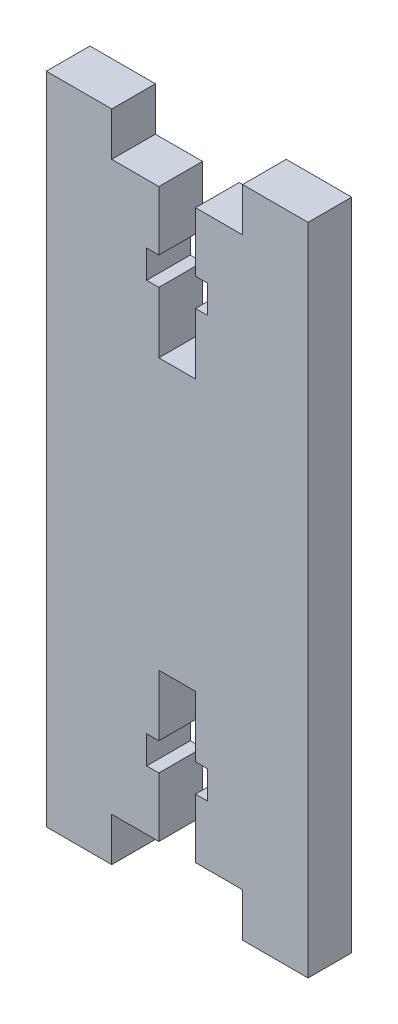
ISO-10303-21;
HEADER;
FILE_DESCRIPTION(('STEP AP214'),'2;1');
FILE_NAME('part.step','',(''),(''),'','','');
FILE_SCHEMA(('AUTOMOTIVE_DESIGN { 1 0 10303 214 1 1 1 1 }'));
ENDSEC;
DATA;
#1=APPLICATION_CONTEXT('core data for automotive mechanical design processes');
#2=APPLICATION_PROTOCOL_DEFINITION('international standard','automotive_design',2000,#1);
#3=PRODUCT_CONTEXT('',#1,'mechanical');
#4=PRODUCT('Part','Part','',(#3));
#5=PRODUCT_RELATED_PRODUCT_CATEGORY('part','',(#4));
#6=PRODUCT_DEFINITION_FORMATION('','',#4);
#7=PRODUCT_DEFINITION_CONTEXT('part definition',#1,'design');
#8=PRODUCT_DEFINITION('design','',#6,#7);
#9=PRODUCT_DEFINITION_SHAPE('','',#8);
#10=(LENGTH_UNIT() NAMED_UNIT(*) SI_UNIT(.MILLI.,.METRE.));
#11=(NAMED_UNIT(*) PLANE_ANGLE_UNIT() SI_UNIT($,.RADIAN.));
#12=(NAMED_UNIT(*) SI_UNIT($,.STERADIAN.) SOLID_ANGLE_UNIT());
#13=UNCERTAINTY_MEASURE_WITH_UNIT(LENGTH_MEASURE(1.E-05),#10,'distance_accuracy_value','');
#14=(GEOMETRIC_REPRESENTATION_CONTEXT(3) GLOBAL_UNCERTAINTY_ASSIGNED_CONTEXT((#13)) GLOBAL_UNIT_ASSIGNED_CONTEXT((#10,
#11,#12)) REPRESENTATION_CONTEXT('',''));
#15=CARTESIAN_POINT('',(0.,0.,0.));
#16=DIRECTION('',(0.,0.,1.));
#17=DIRECTION('',(1.,0.,0.));
#18=AXIS2_PLACEMENT_3D('',#15,#16,#17);
#19=CARTESIAN_POINT('',(0.,0.,5.));
#20=DIRECTION('',(0.,-1.,0.));
#21=DIRECTION('',(1.,0.,0.));
#22=AXIS2_PLACEMENT_3D('',#19,#20,#21);
#23=PLANE('',#22);
#24=DIRECTION('',(-1.,0.,0.));
#25=VECTOR('',#24,1.);
#26=CARTESIAN_POINT('',(0.,0.,0.));
#27=LINE('',#26,#25);
#28=CARTESIAN_POINT('',(-17.1,0.,0.));
#29=VERTEX_POINT('',#28);
#30=CARTESIAN_POINT('',(-22.5,0.,0.));
#31=VERTEX_POINT('',#30);
#32=EDGE_CURVE('E301',#29,#31,#27,.T.);
#33=ORIENTED_EDGE('',*,*,#32,.F.);
#34=DIRECTION('',(0.,0.,-1.));
#35=VECTOR('',#34,1.);
#36=CARTESIAN_POINT('',(-17.1,0.,5.));
#37=LINE('',#36,#35);
#38=CARTESIAN_POINT('',(-17.1,0.,5.));
#39=VERTEX_POINT('',#38);
#40=EDGE_CURVE('E11',#39,#29,#37,.T.);
#41=ORIENTED_EDGE('',*,*,#40,.F.);
#42=DIRECTION('',(-1.,0.,0.));
#43=VECTOR('',#42,1.);
#44=CARTESIAN_POINT('',(0.,0.,5.));
#45=LINE('',#44,#43);
#46=CARTESIAN_POINT('',(-22.5,0.,5.));
#47=VERTEX_POINT('',#46);
#48=EDGE_CURVE('E394',#39,#47,#45,.T.);
#49=ORIENTED_EDGE('',*,*,#48,.T.);
#50=DIRECTION('',(0.,0.,-1.));
#51=VECTOR('',#50,1.);
#52=CARTESIAN_POINT('',(-22.5,0.,5.));
#53=LINE('',#52,#51);
#54=EDGE_CURVE('E54',#47,#31,#53,.T.);
#55=ORIENTED_EDGE('',*,*,#54,.T.);
#56=EDGE_LOOP('',(#33,#41,#49,#55));
#57=FACE_BOUND('',#56,.T.);
#58=ADVANCED_FACE('F37',(#57),#23,.T.);
#59=CARTESIAN_POINT('',(-17.1,0.,5.));
#60=DIRECTION('',(-1.,0.,0.));
#61=DIRECTION('',(0.,-1.,0.));
#62=AXIS2_PLACEMENT_3D('',#59,#60,#61);
#63=PLANE('',#62);
#64=DIRECTION('',(0.,1.,0.));
#65=VECTOR('',#64,1.);
#66=CARTESIAN_POINT('',(-17.1,0.,0.));
#67=LINE('',#66,#65);
#68=CARTESIAN_POINT('',(-17.1,6.79999999999999,0.));
#69=VERTEX_POINT('',#68);
#70=EDGE_CURVE('E303',#29,#69,#67,.T.);
#71=ORIENTED_EDGE('',*,*,#70,.T.);
#72=DIRECTION('',(0.,0.,-1.));
#73=VECTOR('',#72,1.);
#74=CARTESIAN_POINT('',(-17.1,6.79999999999999,5.));
#75=LINE('',#74,#73);
#76=CARTESIAN_POINT('',(-17.1,6.79999999999999,5.));
#77=VERTEX_POINT('',#76);
#78=EDGE_CURVE('E46',#77,#69,#75,.T.);
#79=ORIENTED_EDGE('',*,*,#78,.F.);
#80=DIRECTION('',(0.,1.,0.));
#81=VECTOR('',#80,1.);
#82=CARTESIAN_POINT('',(-17.1,0.,5.));
#83=LINE('',#82,#81);
#84=EDGE_CURVE('E486',#39,#77,#83,.T.);
#85=ORIENTED_EDGE('',*,*,#84,.F.);
#86=ORIENTED_EDGE('',*,*,#40,.T.);
#87=EDGE_LOOP('',(#71,#79,#85,#86));
#88=FACE_BOUND('',#87,.T.);
#89=ADVANCED_FACE('F39',(#88),#63,.F.);
#90=CARTESIAN_POINT('',(0.,6.79999999999999,5.));
#91=DIRECTION('',(0.,1.,0.));
#92=DIRECTION('',(0.,0.,1.));
#93=AXIS2_PLACEMENT_3D('',#90,#91,#92);
#94=PLANE('',#93);
#95=DIRECTION('',(1.,0.,0.));
#96=VECTOR('',#95,1.);
#97=CARTESIAN_POINT('',(0.,6.79999999999999,0.));
#98=LINE('',#97,#96);
#99=CARTESIAN_POINT('',(-18.5,6.79999999999999,0.));
#100=VERTEX_POINT('',#99);
#101=EDGE_CURVE('E307',#100,#69,#98,.T.);
#102=ORIENTED_EDGE('',*,*,#101,.F.);
#103=DIRECTION('',(0.,0.,-1.));
#104=VECTOR('',#103,1.);
#105=CARTESIAN_POINT('',(-18.5,6.79999999999999,5.));
#106=LINE('',#105,#104);
#107=CARTESIAN_POINT('',(-18.5,6.79999999999999,5.));
#108=VERTEX_POINT('',#107);
#109=EDGE_CURVE('E464',#108,#100,#106,.T.);
#110=ORIENTED_EDGE('',*,*,#109,.F.);
#111=DIRECTION('',(1.,0.,0.));
#112=VECTOR('',#111,1.);
#113=CARTESIAN_POINT('',(0.,6.79999999999999,5.));
#114=LINE('',#113,#112);
#115=EDGE_CURVE('E471',#108,#77,#114,.T.);
#116=ORIENTED_EDGE('',*,*,#115,.T.);
#117=ORIENTED_EDGE('',*,*,#78,.T.);
#118=EDGE_LOOP('',(#102,#110,#116,#117));
#119=FACE_BOUND('',#118,.T.);
#120=ADVANCED_FACE('F469',(#119),#94,.T.);
#121=CARTESIAN_POINT('',(-18.5,0.,5.));
#122=DIRECTION('',(1.,0.,0.));
#123=DIRECTION('',(0.,0.,-1.));
#124=AXIS2_PLACEMENT_3D('',#121,#122,#123);
#125=PLANE('',#124);
#126=DIRECTION('',(0.,-1.,0.));
#127=VECTOR('',#126,1.);
#128=CARTESIAN_POINT('',(-18.5,0.,0.));
#129=LINE('',#128,#127);
#130=CARTESIAN_POINT('',(-18.5,9.99999999999999,0.));
#131=VERTEX_POINT('',#130);
#132=EDGE_CURVE('E310',#131,#100,#129,.T.);
#133=ORIENTED_EDGE('',*,*,#132,.F.);
#134=DIRECTION('',(0.,0.,-1.));
#135=VECTOR('',#134,1.);
#136=CARTESIAN_POINT('',(-18.5,9.99999999999999,5.));
#137=LINE('',#136,#135);
#138=CARTESIAN_POINT('',(-18.5,9.99999999999999,5.));
#139=VERTEX_POINT('',#138);
#140=EDGE_CURVE('E462',#139,#131,#137,.T.);
#141=ORIENTED_EDGE('',*,*,#140,.F.);
#142=DIRECTION('',(0.,-1.,0.));
#143=VECTOR('',#142,1.);
#144=CARTESIAN_POINT('',(-18.5,0.,5.));
#145=LINE('',#144,#143);
#146=EDGE_CURVE('E483',#139,#108,#145,.T.);
#147=ORIENTED_EDGE('',*,*,#146,.T.);
#148=ORIENTED_EDGE('',*,*,#109,.T.);
#149=EDGE_LOOP('',(#133,#141,#147,#148));
#150=FACE_BOUND('',#149,.T.);
#151=ADVANCED_FACE('F480',(#150),#125,.T.);
#152=CARTESIAN_POINT('',(0.,9.9999999999999,5.));
#153=DIRECTION('',(0.,-1.,0.));
#154=DIRECTION('',(1.,0.,0.));
#155=AXIS2_PLACEMENT_3D('',#152,#153,#154);
#156=PLANE('',#155);
#157=DIRECTION('',(-1.,0.,0.));
#158=VECTOR('',#157,1.);
#159=CARTESIAN_POINT('',(0.,9.9999999999999,0.));
#160=LINE('',#159,#158);
#161=CARTESIAN_POINT('',(-17.1,9.99999999999998,0.));
#162=VERTEX_POINT('',#161);
#163=EDGE_CURVE('E313',#162,#131,#160,.T.);
#164=ORIENTED_EDGE('',*,*,#163,.F.);
#165=DIRECTION('',(0.,0.,-1.));
#166=VECTOR('',#165,1.);
#167=CARTESIAN_POINT('',(-17.1,9.99999999999998,5.));
#168=LINE('',#167,#166);
#169=CARTESIAN_POINT('',(-17.1,9.99999999999998,5.));
#170=VERTEX_POINT('',#169);
#171=EDGE_CURVE('E460',#170,#162,#168,.T.);
#172=ORIENTED_EDGE('',*,*,#171,.F.);
#173=DIRECTION('',(-1.,0.,0.));
#174=VECTOR('',#173,1.);
#175=CARTESIAN_POINT('',(0.,9.9999999999999,5.));
#176=LINE('',#175,#174);
#177=EDGE_CURVE('E488',#170,#139,#176,.T.);
#178=ORIENTED_EDGE('',*,*,#177,.T.);
#179=ORIENTED_EDGE('',*,*,#140,.T.);
#180=EDGE_LOOP('',(#164,#172,#178,#179));
#181=FACE_BOUND('',#180,.T.);
#182=ADVANCED_FACE('F637',(#181),#156,.T.);
#183=CARTESIAN_POINT('',(-17.1,0.,5.));
#184=DIRECTION('',(-1.,0.,0.));
#185=DIRECTION('',(0.,-1.,0.));
#186=AXIS2_PLACEMENT_3D('',#183,#184,#185);
#187=PLANE('',#186);
#188=DIRECTION('',(0.,1.,0.));
#189=VECTOR('',#188,1.);
#190=CARTESIAN_POINT('',(-17.1,0.,0.));
#191=LINE('',#190,#189);
#192=CARTESIAN_POINT('',(-17.1,17.,0.));
#193=VERTEX_POINT('',#192);
#194=EDGE_CURVE('E316',#162,#193,#191,.T.);
#195=ORIENTED_EDGE('',*,*,#194,.T.);
#196=DIRECTION('',(0.,0.,-1.));
#197=VECTOR('',#196,1.);
#198=CARTESIAN_POINT('',(-17.1,17.,5.));
#199=LINE('',#198,#197);
#200=CARTESIAN_POINT('',(-17.1,17.,5.));
#201=VERTEX_POINT('',#200);
#202=EDGE_CURVE('E457',#201,#193,#199,.T.);
#203=ORIENTED_EDGE('',*,*,#202,.F.);
#204=DIRECTION('',(0.,1.,0.));
#205=VECTOR('',#204,1.);
#206=CARTESIAN_POINT('',(-17.1,0.,5.));
#207=LINE('',#206,#205);
#208=EDGE_CURVE('E494',#170,#201,#207,.T.);
#209=ORIENTED_EDGE('',*,*,#208,.F.);
#210=ORIENTED_EDGE('',*,*,#171,.T.);
#211=EDGE_LOOP('',(#195,#203,#209,#210));
#212=FACE_BOUND('',#211,.T.);
#213=ADVANCED_FACE('F635',(#212),#187,.F.);
#214=CARTESIAN_POINT('',(0.,17.,5.));
#215=DIRECTION('',(0.,1.,0.));
#216=DIRECTION('',(0.,0.,1.));
#217=AXIS2_PLACEMENT_3D('',#214,#215,#216);
#218=PLANE('',#217);
#219=DIRECTION('',(1.,0.,0.));
#220=VECTOR('',#219,1.);
#221=CARTESIAN_POINT('',(0.,17.,0.));
#222=LINE('',#221,#220);
#223=CARTESIAN_POINT('',(-12.9,17.,0.));
#224=VERTEX_POINT('',#223);
#225=EDGE_CURVE('E318',#193,#224,#222,.T.);
#226=ORIENTED_EDGE('',*,*,#225,.T.);
#227=DIRECTION('',(0.,0.,-1.));
#228=VECTOR('',#227,1.);
#229=CARTESIAN_POINT('',(-12.9,17.,5.));
#230=LINE('',#229,#228);
#231=CARTESIAN_POINT('',(-12.9,17.,5.));
#232=VERTEX_POINT('',#231);
#233=EDGE_CURVE('E455',#232,#224,#230,.T.);
#234=ORIENTED_EDGE('',*,*,#233,.F.);
#235=DIRECTION('',(1.,0.,0.));
#236=VECTOR('',#235,1.);
#237=CARTESIAN_POINT('',(0.,17.,5.));
#238=LINE('',#237,#236);
#239=EDGE_CURVE('E496',#201,#232,#238,.T.);
#240=ORIENTED_EDGE('',*,*,#239,.F.);
#241=ORIENTED_EDGE('',*,*,#202,.T.);
#242=EDGE_LOOP('',(#226,#234,#240,#241));
#243=FACE_BOUND('',#242,.T.);
#244=ADVANCED_FACE('F630',(#243),#218,.F.);
#245=CARTESIAN_POINT('',(-12.9,0.,5.));
#246=DIRECTION('',(-1.,0.,0.));
#247=DIRECTION('',(0.,-1.,0.));
#248=AXIS2_PLACEMENT_3D('',#245,#246,#247);
#249=PLANE('',#248);
#250=DIRECTION('',(0.,1.,0.));
#251=VECTOR('',#250,1.);
#252=CARTESIAN_POINT('',(-12.9,0.,0.));
#253=LINE('',#252,#251);
#254=CARTESIAN_POINT('',(-12.9,9.99999999999998,0.));
#255=VERTEX_POINT('',#254);
#256=EDGE_CURVE('E321',#255,#224,#253,.T.);
#257=ORIENTED_EDGE('',*,*,#256,.F.);
#258=DIRECTION('',(0.,0.,-1.));
#259=VECTOR('',#258,1.);
#260=CARTESIAN_POINT('',(-12.9,9.99999999999998,5.));
#261=LINE('',#260,#259);
#262=CARTESIAN_POINT('',(-12.9,9.99999999999998,5.));
#263=VERTEX_POINT('',#262);
#264=EDGE_CURVE('E453',#263,#255,#261,.T.);
#265=ORIENTED_EDGE('',*,*,#264,.F.);
#266=DIRECTION('',(0.,1.,0.));
#267=VECTOR('',#266,1.);
#268=CARTESIAN_POINT('',(-12.9,0.,5.));
#269=LINE('',#268,#267);
#270=EDGE_CURVE('E498',#263,#232,#269,.T.);
#271=ORIENTED_EDGE('',*,*,#270,.T.);
#272=ORIENTED_EDGE('',*,*,#233,.T.);
#273=EDGE_LOOP('',(#257,#265,#271,#272));
#274=FACE_BOUND('',#273,.T.);
#275=ADVANCED_FACE('F626',(#274),#249,.T.);
#276=CARTESIAN_POINT('',(0.,10.,5.));
#277=DIRECTION('',(0.,1.,0.));
#278=DIRECTION('',(-1.,0.,0.));
#279=AXIS2_PLACEMENT_3D('',#276,#277,#278);
#280=PLANE('',#279);
#281=DIRECTION('',(1.,0.,0.));
#282=VECTOR('',#281,1.);
#283=CARTESIAN_POINT('',(0.,10.,0.));
#284=LINE('',#283,#282);
#285=CARTESIAN_POINT('',(-11.5,9.99999999999999,0.));
#286=VERTEX_POINT('',#285);
#287=EDGE_CURVE('E324',#255,#286,#284,.T.);
#288=ORIENTED_EDGE('',*,*,#287,.T.);
#289=DIRECTION('',(0.,0.,-1.));
#290=VECTOR('',#289,1.);
#291=CARTESIAN_POINT('',(-11.5,9.99999999999999,5.));
#292=LINE('',#291,#290);
#293=CARTESIAN_POINT('',(-11.5,9.99999999999999,5.));
#294=VERTEX_POINT('',#293);
#295=EDGE_CURVE('E450',#294,#286,#292,.T.);
#296=ORIENTED_EDGE('',*,*,#295,.F.);
#297=DIRECTION('',(1.,0.,0.));
#298=VECTOR('',#297,1.);
#299=CARTESIAN_POINT('',(0.,10.,5.));
#300=LINE('',#299,#298);
#301=EDGE_CURVE('E501',#263,#294,#300,.T.);
#302=ORIENTED_EDGE('',*,*,#301,.F.);
#303=ORIENTED_EDGE('',*,*,#264,.T.);
#304=EDGE_LOOP('',(#288,#296,#302,#303));
#305=FACE_BOUND('',#304,.T.);
#306=ADVANCED_FACE('F623',(#305),#280,.F.);
#307=CARTESIAN_POINT('',(-11.5,0.,5.));
#308=DIRECTION('',(1.,0.,0.));
#309=DIRECTION('',(0.,0.,-1.));
#310=AXIS2_PLACEMENT_3D('',#307,#308,#309);
#311=PLANE('',#310);
#312=DIRECTION('',(0.,-1.,0.));
#313=VECTOR('',#312,1.);
#314=CARTESIAN_POINT('',(-11.5,0.,0.));
#315=LINE('',#314,#313);
#316=CARTESIAN_POINT('',(-11.5,6.79999999999999,0.));
#317=VERTEX_POINT('',#316);
#318=EDGE_CURVE('E326',#286,#317,#315,.T.);
#319=ORIENTED_EDGE('',*,*,#318,.T.);
#320=DIRECTION('',(0.,0.,-1.));
#321=VECTOR('',#320,1.);
#322=CARTESIAN_POINT('',(-11.5,6.79999999999999,5.));
#323=LINE('',#322,#321);
#324=CARTESIAN_POINT('',(-11.5,6.79999999999999,5.));
#325=VERTEX_POINT('',#324);
#326=EDGE_CURVE('E447',#325,#317,#323,.T.);
#327=ORIENTED_EDGE('',*,*,#326,.F.);
#328=DIRECTION('',(0.,-1.,0.));
#329=VECTOR('',#328,1.);
#330=CARTESIAN_POINT('',(-11.5,0.,5.));
#331=LINE('',#330,#329);
#332=EDGE_CURVE('E503',#294,#325,#331,.T.);
#333=ORIENTED_EDGE('',*,*,#332,.F.);
#334=ORIENTED_EDGE('',*,*,#295,.T.);
#335=EDGE_LOOP('',(#319,#327,#333,#334));
#336=FACE_BOUND('',#335,.T.);
#337=ADVANCED_FACE('F618',(#336),#311,.F.);
#338=CARTESIAN_POINT('',(0.,6.79999999999999,5.));
#339=DIRECTION('',(0.,-1.,0.));
#340=DIRECTION('',(0.,0.,-1.));
#341=AXIS2_PLACEMENT_3D('',#338,#339,#340);
#342=PLANE('',#341);
#343=DIRECTION('',(-1.,0.,0.));
#344=VECTOR('',#343,1.);
#345=CARTESIAN_POINT('',(0.,6.79999999999999,0.));
#346=LINE('',#345,#344);
#347=CARTESIAN_POINT('',(-12.9,6.79999999999999,0.));
#348=VERTEX_POINT('',#347);
#349=EDGE_CURVE('E328',#317,#348,#346,.T.);
#350=ORIENTED_EDGE('',*,*,#349,.T.);
#351=DIRECTION('',(0.,0.,-1.));
#352=VECTOR('',#351,1.);
#353=CARTESIAN_POINT('',(-12.9,6.79999999999999,5.));
#354=LINE('',#353,#352);
#355=CARTESIAN_POINT('',(-12.9,6.79999999999999,5.));
#356=VERTEX_POINT('',#355);
#357=EDGE_CURVE('E445',#356,#348,#354,.T.);
#358=ORIENTED_EDGE('',*,*,#357,.F.);
#359=DIRECTION('',(-1.,0.,0.));
#360=VECTOR('',#359,1.);
#361=CARTESIAN_POINT('',(0.,6.79999999999999,5.));
#362=LINE('',#361,#360);
#363=EDGE_CURVE('E505',#325,#356,#362,.T.);
#364=ORIENTED_EDGE('',*,*,#363,.F.);
#365=ORIENTED_EDGE('',*,*,#326,.T.);
#366=EDGE_LOOP('',(#350,#358,#364,#365));
#367=FACE_BOUND('',#366,.T.);
#368=ADVANCED_FACE('F595',(#367),#342,.F.);
#369=CARTESIAN_POINT('',(-12.9,0.,5.));
#370=DIRECTION('',(-1.,0.,0.));
#371=DIRECTION('',(0.,-1.,0.));
#372=AXIS2_PLACEMENT_3D('',#369,#370,#371);
#373=PLANE('',#372);
#374=DIRECTION('',(0.,1.,0.));
#375=VECTOR('',#374,1.);
#376=CARTESIAN_POINT('',(-12.9,0.,0.));
#377=LINE('',#376,#375);
#378=CARTESIAN_POINT('',(-12.9,0.,0.));
#379=VERTEX_POINT('',#378);
#380=EDGE_CURVE('E331',#379,#348,#377,.T.);
#381=ORIENTED_EDGE('',*,*,#380,.F.);
#382=DIRECTION('',(0.,0.,-1.));
#383=VECTOR('',#382,1.);
#384=CARTESIAN_POINT('',(-12.9,0.,5.));
#385=LINE('',#384,#383);
#386=CARTESIAN_POINT('',(-12.9,0.,5.));
#387=VERTEX_POINT('',#386);
#388=EDGE_CURVE('E443',#387,#379,#385,.T.);
#389=ORIENTED_EDGE('',*,*,#388,.F.);
#390=DIRECTION('',(0.,1.,0.));
#391=VECTOR('',#390,1.);
#392=CARTESIAN_POINT('',(-12.9,0.,5.));
#393=LINE('',#392,#391);
#394=EDGE_CURVE('E507',#387,#356,#393,.T.);
#395=ORIENTED_EDGE('',*,*,#394,.T.);
#396=ORIENTED_EDGE('',*,*,#357,.T.);
#397=EDGE_LOOP('',(#381,#389,#395,#396));
#398=FACE_BOUND('',#397,.T.);
#399=ADVANCED_FACE('F587',(#398),#373,.T.);
#400=CARTESIAN_POINT('',(-7.50000000000001,0.,0.));
#401=VERTEX_POINT('',#400);
#402=EDGE_CURVE('E304',#401,#379,#27,.T.);
#403=ORIENTED_EDGE('',*,*,#402,.F.);
#404=DIRECTION('',(0.,0.,-1.));
#405=VECTOR('',#404,1.);
#406=CARTESIAN_POINT('',(-7.50000000000001,0.,5.));
#407=LINE('',#406,#405);
#408=CARTESIAN_POINT('',(-7.50000000000001,0.,5.));
#409=VERTEX_POINT('',#408);
#410=EDGE_CURVE('E441',#409,#401,#407,.T.);
#411=ORIENTED_EDGE('',*,*,#410,.F.);
#412=EDGE_CURVE('E510',#409,#387,#45,.T.);
#413=ORIENTED_EDGE('',*,*,#412,.T.);
#414=ORIENTED_EDGE('',*,*,#388,.T.);
#415=EDGE_LOOP('',(#403,#411,#413,#414));
#416=FACE_BOUND('',#415,.T.);
#417=ADVANCED_FACE('F579',(#416),#23,.T.);
#418=CARTESIAN_POINT('',(-7.50000000000001,0.,5.));
#419=DIRECTION('',(1.,0.,0.));
#420=DIRECTION('',(0.,0.,-1.));
#421=AXIS2_PLACEMENT_3D('',#418,#419,#420);
#422=PLANE('',#421);
#423=DIRECTION('',(0.,-1.,0.));
#424=VECTOR('',#423,1.);
#425=CARTESIAN_POINT('',(-7.50000000000001,0.,0.));
#426=LINE('',#425,#424);
#427=CARTESIAN_POINT('',(-7.50000000000001,-5.00000000000002,0.));
#428=VERTEX_POINT('',#427);
#429=EDGE_CURVE('E334',#401,#428,#426,.T.);
#430=ORIENTED_EDGE('',*,*,#429,.T.);
#431=DIRECTION('',(0.,0.,-1.));
#432=VECTOR('',#431,1.);
#433=CARTESIAN_POINT('',(-7.50000000000001,-5.00000000000002,5.));
#434=LINE('',#433,#432);
#435=CARTESIAN_POINT('',(-7.50000000000001,-5.00000000000002,5.));
#436=VERTEX_POINT('',#435);
#437=EDGE_CURVE('E439',#436,#428,#434,.T.);
#438=ORIENTED_EDGE('',*,*,#437,.F.);
#439=DIRECTION('',(0.,-1.,0.));
#440=VECTOR('',#439,1.);
#441=CARTESIAN_POINT('',(-7.50000000000001,0.,5.));
#442=LINE('',#441,#440);
#443=EDGE_CURVE('E511',#409,#436,#442,.T.);
#444=ORIENTED_EDGE('',*,*,#443,.F.);
#445=ORIENTED_EDGE('',*,*,#410,.T.);
#446=EDGE_LOOP('',(#430,#438,#444,#445));
#447=FACE_BOUND('',#446,.T.);
#448=ADVANCED_FACE('F586',(#447),#422,.F.);
#449=CARTESIAN_POINT('',(0.,-5.00000000000002,5.));
#450=DIRECTION('',(0.,-1.,0.));
#451=DIRECTION('',(0.,0.,-1.));
#452=AXIS2_PLACEMENT_3D('',#449,#450,#451);
#453=PLANE('',#452);
#454=DIRECTION('',(-1.,0.,0.));
#455=VECTOR('',#454,1.);
#456=CARTESIAN_POINT('',(0.,-5.00000000000002,0.));
#457=LINE('',#456,#455);
#458=CARTESIAN_POINT('',(0.,-5.00000000000002,0.));
#459=VERTEX_POINT('',#458);
#460=EDGE_CURVE('E337',#459,#428,#457,.T.);
#461=ORIENTED_EDGE('',*,*,#460,.F.);
#462=DIRECTION('',(0.,0.,-1.));
#463=VECTOR('',#462,1.);
#464=CARTESIAN_POINT('',(0.,-5.00000000000002,5.));
#465=LINE('',#464,#463);
#466=CARTESIAN_POINT('',(0.,-5.00000000000002,5.));
#467=VERTEX_POINT('',#466);
#468=EDGE_CURVE('E437',#467,#459,#465,.T.);
#469=ORIENTED_EDGE('',*,*,#468,.F.);
#470=DIRECTION('',(-1.,0.,0.));
#471=VECTOR('',#470,1.);
#472=CARTESIAN_POINT('',(0.,-5.00000000000002,5.));
#473=LINE('',#472,#471);
#474=EDGE_CURVE('E513',#467,#436,#473,.T.);
#475=ORIENTED_EDGE('',*,*,#474,.T.);
#476=ORIENTED_EDGE('',*,*,#437,.T.);
#477=EDGE_LOOP('',(#461,#469,#475,#476));
#478=FACE_BOUND('',#477,.T.);
#479=ADVANCED_FACE('F593',(#478),#453,.T.);
#480=CARTESIAN_POINT('',(0.,0.,5.));
#481=DIRECTION('',(-1.,0.,0.));
#482=DIRECTION('',(0.,0.,1.));
#483=AXIS2_PLACEMENT_3D('',#480,#481,#482);
#484=PLANE('',#483);
#485=DIRECTION('',(0.,1.,0.));
#486=VECTOR('',#485,1.);
#487=CARTESIAN_POINT('',(0.,0.,0.));
#488=LINE('',#487,#486);
#489=CARTESIAN_POINT('',(0.,70.,0.));
#490=VERTEX_POINT('',#489);
#491=EDGE_CURVE('E340',#459,#490,#488,.T.);
#492=ORIENTED_EDGE('',*,*,#491,.T.);
#493=DIRECTION('',(0.,0.,-1.));
#494=VECTOR('',#493,1.);
#495=CARTESIAN_POINT('',(0.,70.,5.));
#496=LINE('',#495,#494);
#497=CARTESIAN_POINT('',(0.,70.,5.));
#498=VERTEX_POINT('',#497);
#499=EDGE_CURVE('E434',#498,#490,#496,.T.);
#500=ORIENTED_EDGE('',*,*,#499,.F.);
#501=DIRECTION('',(0.,1.,0.));
#502=VECTOR('',#501,1.);
#503=CARTESIAN_POINT('',(0.,0.,5.));
#504=LINE('',#503,#502);
#505=EDGE_CURVE('E516',#467,#498,#504,.T.);
#506=ORIENTED_EDGE('',*,*,#505,.F.);
#507=ORIENTED_EDGE('',*,*,#468,.T.);
#508=EDGE_LOOP('',(#492,#500,#506,#507));
#509=FACE_BOUND('',#508,.T.);
#510=ADVANCED_FACE('F731',(#509),#484,.F.);
#511=CARTESIAN_POINT('',(0.,70.,5.));
#512=DIRECTION('',(0.,-1.,0.));
#513=DIRECTION('',(0.,0.,-1.));
#514=AXIS2_PLACEMENT_3D('',#511,#512,#513);
#515=PLANE('',#514);
#516=DIRECTION('',(-1.,0.,0.));
#517=VECTOR('',#516,1.);
#518=CARTESIAN_POINT('',(0.,70.,0.));
#519=LINE('',#518,#517);
#520=CARTESIAN_POINT('',(-7.5,70.,0.));
#521=VERTEX_POINT('',#520);
#522=EDGE_CURVE('E342',#490,#521,#519,.T.);
#523=ORIENTED_EDGE('',*,*,#522,.T.);
#524=DIRECTION('',(0.,0.,-1.));
#525=VECTOR('',#524,1.);
#526=CARTESIAN_POINT('',(-7.5,70.,5.));
#527=LINE('',#526,#525);
#528=CARTESIAN_POINT('',(-7.5,70.,5.));
#529=VERTEX_POINT('',#528);
#530=EDGE_CURVE('E432',#529,#521,#527,.T.);
#531=ORIENTED_EDGE('',*,*,#530,.F.);
#532=DIRECTION('',(-1.,0.,0.));
#533=VECTOR('',#532,1.);
#534=CARTESIAN_POINT('',(0.,70.,5.));
#535=LINE('',#534,#533);
#536=EDGE_CURVE('E518',#498,#529,#535,.T.);
#537=ORIENTED_EDGE('',*,*,#536,.F.);
#538=ORIENTED_EDGE('',*,*,#499,.T.);
#539=EDGE_LOOP('',(#523,#531,#537,#538));
#540=FACE_BOUND('',#539,.T.);
#541=ADVANCED_FACE('F742',(#540),#515,.F.);
#542=CARTESIAN_POINT('',(-7.5,0.,5.));
#543=DIRECTION('',(-1.,0.,0.));
#544=DIRECTION('',(0.,0.,1.));
#545=AXIS2_PLACEMENT_3D('',#542,#543,#544);
#546=PLANE('',#545);
#547=DIRECTION('',(0.,1.,0.));
#548=VECTOR('',#547,1.);
#549=CARTESIAN_POINT('',(-7.5,0.,0.));
#550=LINE('',#549,#548);
#551=CARTESIAN_POINT('',(-7.5,65.,0.));
#552=VERTEX_POINT('',#551);
#553=EDGE_CURVE('E345',#552,#521,#550,.T.);
#554=ORIENTED_EDGE('',*,*,#553,.F.);
#555=DIRECTION('',(0.,0.,-1.));
#556=VECTOR('',#555,1.);
#557=CARTESIAN_POINT('',(-7.5,65.,5.));
#558=LINE('',#557,#556);
#559=CARTESIAN_POINT('',(-7.5,65.,5.));
#560=VERTEX_POINT('',#559);
#561=EDGE_CURVE('E430',#560,#552,#558,.T.);
#562=ORIENTED_EDGE('',*,*,#561,.F.);
#563=DIRECTION('',(0.,1.,0.));
#564=VECTOR('',#563,1.);
#565=CARTESIAN_POINT('',(-7.5,0.,5.));
#566=LINE('',#565,#564);
#567=EDGE_CURVE('E520',#560,#529,#566,.T.);
#568=ORIENTED_EDGE('',*,*,#567,.T.);
#569=ORIENTED_EDGE('',*,*,#530,.T.);
#570=EDGE_LOOP('',(#554,#562,#568,#569));
#571=FACE_BOUND('',#570,.T.);
#572=ADVANCED_FACE('F753',(#571),#546,.T.);
#573=CARTESIAN_POINT('',(0.,65.,5.));
#574=DIRECTION('',(0.,-1.,0.));
#575=DIRECTION('',(0.,0.,-1.));
#576=AXIS2_PLACEMENT_3D('',#573,#574,#575);
#577=PLANE('',#576);
#578=DIRECTION('',(-1.,0.,0.));
#579=VECTOR('',#578,1.);
#580=CARTESIAN_POINT('',(0.,65.,0.));
#581=LINE('',#580,#579);
#582=CARTESIAN_POINT('',(-12.9,65.,0.));
#583=VERTEX_POINT('',#582);
#584=EDGE_CURVE('E348',#552,#583,#581,.T.);
#585=ORIENTED_EDGE('',*,*,#584,.T.);
#586=DIRECTION('',(0.,0.,-1.));
#587=VECTOR('',#586,1.);
#588=CARTESIAN_POINT('',(-12.9,65.,5.));
#589=LINE('',#588,#587);
#590=CARTESIAN_POINT('',(-12.9,65.,5.));
#591=VERTEX_POINT('',#590);
#592=EDGE_CURVE('E427',#591,#583,#589,.T.);
#593=ORIENTED_EDGE('',*,*,#592,.F.);
#594=DIRECTION('',(-1.,0.,0.));
#595=VECTOR('',#594,1.);
#596=CARTESIAN_POINT('',(0.,65.,5.));
#597=LINE('',#596,#595);
#598=EDGE_CURVE('E523',#560,#591,#597,.T.);
#599=ORIENTED_EDGE('',*,*,#598,.F.);
#600=ORIENTED_EDGE('',*,*,#561,.T.);
#601=EDGE_LOOP('',(#585,#593,#599,#600));
#602=FACE_BOUND('',#601,.T.);
#603=ADVANCED_FACE('F763',(#602),#577,.F.);
#604=CARTESIAN_POINT('',(-12.8999999999999,0.,5.));
#605=DIRECTION('',(1.,0.,0.));
#606=DIRECTION('',(0.,1.,0.));
#607=AXIS2_PLACEMENT_3D('',#604,#605,#606);
#608=PLANE('',#607);
#609=DIRECTION('',(0.,-1.,0.));
#610=VECTOR('',#609,1.);
#611=CARTESIAN_POINT('',(-12.8999999999999,0.,0.));
#612=LINE('',#611,#610);
#613=CARTESIAN_POINT('',(-12.9,58.2,0.));
#614=VERTEX_POINT('',#613);
#615=EDGE_CURVE('E350',#583,#614,#612,.T.);
#616=ORIENTED_EDGE('',*,*,#615,.T.);
#617=DIRECTION('',(0.,0.,-1.));
#618=VECTOR('',#617,1.);
#619=CARTESIAN_POINT('',(-12.9,58.2,5.));
#620=LINE('',#619,#618);
#621=CARTESIAN_POINT('',(-12.9,58.2,5.));
#622=VERTEX_POINT('',#621);
#623=EDGE_CURVE('E425',#622,#614,#620,.T.);
#624=ORIENTED_EDGE('',*,*,#623,.F.);
#625=DIRECTION('',(0.,-1.,0.));
#626=VECTOR('',#625,1.);
#627=CARTESIAN_POINT('',(-12.8999999999999,0.,5.));
#628=LINE('',#627,#626);
#629=EDGE_CURVE('E525',#591,#622,#628,.T.);
#630=ORIENTED_EDGE('',*,*,#629,.F.);
#631=ORIENTED_EDGE('',*,*,#592,.T.);
#632=EDGE_LOOP('',(#616,#624,#630,#631));
#633=FACE_BOUND('',#632,.T.);
#634=ADVANCED_FACE('F774',(#633),#608,.F.);
#635=CARTESIAN_POINT('',(0.,58.2,5.));
#636=DIRECTION('',(0.,-1.,0.));
#637=DIRECTION('',(0.,0.,-1.));
#638=AXIS2_PLACEMENT_3D('',#635,#636,#637);
#639=PLANE('',#638);
#640=DIRECTION('',(-1.,0.,0.));
#641=VECTOR('',#640,1.);
#642=CARTESIAN_POINT('',(0.,58.2,0.));
#643=LINE('',#642,#641);
#644=CARTESIAN_POINT('',(-11.5,58.2,0.));
#645=VERTEX_POINT('',#644);
#646=EDGE_CURVE('E354',#645,#614,#643,.T.);
#647=ORIENTED_EDGE('',*,*,#646,.F.);
#648=DIRECTION('',(0.,0.,-1.));
#649=VECTOR('',#648,1.);
#650=CARTESIAN_POINT('',(-11.5,58.2,5.));
#651=LINE('',#650,#649);
#652=CARTESIAN_POINT('',(-11.5,58.2,5.));
#653=VERTEX_POINT('',#652);
#654=EDGE_CURVE('E423',#653,#645,#651,.T.);
#655=ORIENTED_EDGE('',*,*,#654,.F.);
#656=DIRECTION('',(-1.,0.,0.));
#657=VECTOR('',#656,1.);
#658=CARTESIAN_POINT('',(0.,58.2,5.));
#659=LINE('',#658,#657);
#660=EDGE_CURVE('E528',#653,#622,#659,.T.);
#661=ORIENTED_EDGE('',*,*,#660,.T.);
#662=ORIENTED_EDGE('',*,*,#623,.T.);
#663=EDGE_LOOP('',(#647,#655,#661,#662));
#664=FACE_BOUND('',#663,.T.);
#665=ADVANCED_FACE('F784',(#664),#639,.T.);
#666=CARTESIAN_POINT('',(-11.5,0.,5.));
#667=DIRECTION('',(-1.,0.,0.));
#668=DIRECTION('',(0.,0.,1.));
#669=AXIS2_PLACEMENT_3D('',#666,#667,#668);
#670=PLANE('',#669);
#671=DIRECTION('',(0.,1.,0.));
#672=VECTOR('',#671,1.);
#673=CARTESIAN_POINT('',(-11.5,0.,0.));
#674=LINE('',#673,#672);
#675=CARTESIAN_POINT('',(-11.5,55.,0.));
#676=VERTEX_POINT('',#675);
#677=EDGE_CURVE('E357',#676,#645,#674,.T.);
#678=ORIENTED_EDGE('',*,*,#677,.F.);
#679=DIRECTION('',(0.,0.,-1.));
#680=VECTOR('',#679,1.);
#681=CARTESIAN_POINT('',(-11.5,55.,5.));
#682=LINE('',#681,#680);
#683=CARTESIAN_POINT('',(-11.5,55.,5.));
#684=VERTEX_POINT('',#683);
#685=EDGE_CURVE('E421',#684,#676,#682,.T.);
#686=ORIENTED_EDGE('',*,*,#685,.F.);
#687=DIRECTION('',(0.,1.,0.));
#688=VECTOR('',#687,1.);
#689=CARTESIAN_POINT('',(-11.5,0.,5.));
#690=LINE('',#689,#688);
#691=EDGE_CURVE('E531',#684,#653,#690,.T.);
#692=ORIENTED_EDGE('',*,*,#691,.T.);
#693=ORIENTED_EDGE('',*,*,#654,.T.);
#694=EDGE_LOOP('',(#678,#686,#692,#693));
#695=FACE_BOUND('',#694,.T.);
#696=ADVANCED_FACE('F794',(#695),#670,.T.);
#697=CARTESIAN_POINT('',(2.72599403367783E-13,54.9999999999999,5.));
#698=DIRECTION('',(0.,1.,0.));
#699=DIRECTION('',(-1.,0.,0.));
#700=AXIS2_PLACEMENT_3D('',#697,#698,#699);
#701=PLANE('',#700);
#702=DIRECTION('',(1.,0.,0.));
#703=VECTOR('',#702,1.);
#704=CARTESIAN_POINT('',(2.72599403367783E-13,54.9999999999999,0.));
#705=LINE('',#704,#703);
#706=CARTESIAN_POINT('',(-12.9,55.,0.));
#707=VERTEX_POINT('',#706);
#708=EDGE_CURVE('E360',#707,#676,#705,.T.);
#709=ORIENTED_EDGE('',*,*,#708,.F.);
#710=DIRECTION('',(0.,0.,-1.));
#711=VECTOR('',#710,1.);
#712=CARTESIAN_POINT('',(-12.9,55.,5.));
#713=LINE('',#712,#711);
#714=CARTESIAN_POINT('',(-12.9,55.,5.));
#715=VERTEX_POINT('',#714);
#716=EDGE_CURVE('E419',#715,#707,#713,.T.);
#717=ORIENTED_EDGE('',*,*,#716,.F.);
#718=DIRECTION('',(1.,0.,0.));
#719=VECTOR('',#718,1.);
#720=CARTESIAN_POINT('',(2.72599403367783E-13,54.9999999999999,5.));
#721=LINE('',#720,#719);
#722=EDGE_CURVE('E534',#715,#684,#721,.T.);
#723=ORIENTED_EDGE('',*,*,#722,.T.);
#724=ORIENTED_EDGE('',*,*,#685,.T.);
#725=EDGE_LOOP('',(#709,#717,#723,#724));
#726=FACE_BOUND('',#725,.T.);
#727=ADVANCED_FACE('F804',(#726),#701,.T.);
#728=CARTESIAN_POINT('',(-12.9,0.,5.));
#729=DIRECTION('',(1.,0.,0.));
#730=DIRECTION('',(0.,1.,0.));
#731=AXIS2_PLACEMENT_3D('',#728,#729,#730);
#732=PLANE('',#731);
#733=DIRECTION('',(0.,-1.,0.));
#734=VECTOR('',#733,1.);
#735=CARTESIAN_POINT('',(-12.9,0.,0.));
#736=LINE('',#735,#734);
#737=CARTESIAN_POINT('',(-12.9,48.,0.));
#738=VERTEX_POINT('',#737);
#739=EDGE_CURVE('E363',#707,#738,#736,.T.);
#740=ORIENTED_EDGE('',*,*,#739,.T.);
#741=DIRECTION('',(0.,0.,-1.));
#742=VECTOR('',#741,1.);
#743=CARTESIAN_POINT('',(-12.9,48.,5.));
#744=LINE('',#743,#742);
#745=CARTESIAN_POINT('',(-12.9,48.,5.));
#746=VERTEX_POINT('',#745);
#747=EDGE_CURVE('E417',#746,#738,#744,.T.);
#748=ORIENTED_EDGE('',*,*,#747,.F.);
#749=DIRECTION('',(0.,-1.,0.));
#750=VECTOR('',#749,1.);
#751=CARTESIAN_POINT('',(-12.9,0.,5.));
#752=LINE('',#751,#750);
#753=EDGE_CURVE('E537',#715,#746,#752,.T.);
#754=ORIENTED_EDGE('',*,*,#753,.F.);
#755=ORIENTED_EDGE('',*,*,#716,.T.);
#756=EDGE_LOOP('',(#740,#748,#754,#755));
#757=FACE_BOUND('',#756,.T.);
#758=ADVANCED_FACE('F814',(#757),#732,.F.);
#759=CARTESIAN_POINT('',(0.,48.,5.));
#760=DIRECTION('',(0.,1.,0.));
#761=DIRECTION('',(0.,0.,1.));
#762=AXIS2_PLACEMENT_3D('',#759,#760,#761);
#763=PLANE('',#762);
#764=DIRECTION('',(1.,0.,0.));
#765=VECTOR('',#764,1.);
#766=CARTESIAN_POINT('',(0.,48.,0.));
#767=LINE('',#766,#765);
#768=CARTESIAN_POINT('',(-17.1,48.,0.));
#769=VERTEX_POINT('',#768);
#770=EDGE_CURVE('E366',#769,#738,#767,.T.);
#771=ORIENTED_EDGE('',*,*,#770,.F.);
#772=DIRECTION('',(0.,0.,-1.));
#773=VECTOR('',#772,1.);
#774=CARTESIAN_POINT('',(-17.1,48.,5.));
#775=LINE('',#774,#773);
#776=CARTESIAN_POINT('',(-17.1,48.,5.));
#777=VERTEX_POINT('',#776);
#778=EDGE_CURVE('E415',#777,#769,#775,.T.);
#779=ORIENTED_EDGE('',*,*,#778,.F.);
#780=DIRECTION('',(1.,0.,0.));
#781=VECTOR('',#780,1.);
#782=CARTESIAN_POINT('',(0.,48.,5.));
#783=LINE('',#782,#781);
#784=EDGE_CURVE('E539',#777,#746,#783,.T.);
#785=ORIENTED_EDGE('',*,*,#784,.T.);
#786=ORIENTED_EDGE('',*,*,#747,.T.);
#787=EDGE_LOOP('',(#771,#779,#785,#786));
#788=FACE_BOUND('',#787,.T.);
#789=ADVANCED_FACE('F824',(#788),#763,.T.);
#790=CARTESIAN_POINT('',(-17.1,0.,5.));
#791=DIRECTION('',(1.,0.,0.));
#792=DIRECTION('',(0.,1.,0.));
#793=AXIS2_PLACEMENT_3D('',#790,#791,#792);
#794=PLANE('',#793);
#795=DIRECTION('',(0.,-1.,0.));
#796=VECTOR('',#795,1.);
#797=CARTESIAN_POINT('',(-17.1,0.,0.));
#798=LINE('',#797,#796);
#799=CARTESIAN_POINT('',(-17.1,55.,0.));
#800=VERTEX_POINT('',#799);
#801=EDGE_CURVE('E369',#800,#769,#798,.T.);
#802=ORIENTED_EDGE('',*,*,#801,.F.);
#803=DIRECTION('',(0.,0.,-1.));
#804=VECTOR('',#803,1.);
#805=CARTESIAN_POINT('',(-17.1,55.,5.));
#806=LINE('',#805,#804);
#807=CARTESIAN_POINT('',(-17.1,55.,5.));
#808=VERTEX_POINT('',#807);
#809=EDGE_CURVE('E413',#808,#800,#806,.T.);
#810=ORIENTED_EDGE('',*,*,#809,.F.);
#811=DIRECTION('',(0.,-1.,0.));
#812=VECTOR('',#811,1.);
#813=CARTESIAN_POINT('',(-17.1,0.,5.));
#814=LINE('',#813,#812);
#815=EDGE_CURVE('E542',#808,#777,#814,.T.);
#816=ORIENTED_EDGE('',*,*,#815,.T.);
#817=ORIENTED_EDGE('',*,*,#778,.T.);
#818=EDGE_LOOP('',(#802,#810,#816,#817));
#819=FACE_BOUND('',#818,.T.);
#820=ADVANCED_FACE('F834',(#819),#794,.T.);
#821=CARTESIAN_POINT('',(-2.72599403367784E-13,55.0000000000001,5.));
#822=DIRECTION('',(0.,-1.,0.));
#823=DIRECTION('',(1.,0.,0.));
#824=AXIS2_PLACEMENT_3D('',#821,#822,#823);
#825=PLANE('',#824);
#826=DIRECTION('',(-1.,0.,0.));
#827=VECTOR('',#826,1.);
#828=CARTESIAN_POINT('',(-2.72599403367784E-13,55.0000000000001,0.));
#829=LINE('',#828,#827);
#830=CARTESIAN_POINT('',(-18.5,55.,0.));
#831=VERTEX_POINT('',#830);
#832=EDGE_CURVE('E372',#800,#831,#829,.T.);
#833=ORIENTED_EDGE('',*,*,#832,.T.);
#834=DIRECTION('',(0.,0.,-1.));
#835=VECTOR('',#834,1.);
#836=CARTESIAN_POINT('',(-18.5,55.,5.));
#837=LINE('',#836,#835);
#838=CARTESIAN_POINT('',(-18.5,55.,5.));
#839=VERTEX_POINT('',#838);
#840=EDGE_CURVE('E410',#839,#831,#837,.T.);
#841=ORIENTED_EDGE('',*,*,#840,.F.);
#842=DIRECTION('',(-1.,0.,0.));
#843=VECTOR('',#842,1.);
#844=CARTESIAN_POINT('',(-2.72599403367784E-13,55.0000000000001,5.));
#845=LINE('',#844,#843);
#846=EDGE_CURVE('E545',#808,#839,#845,.T.);
#847=ORIENTED_EDGE('',*,*,#846,.F.);
#848=ORIENTED_EDGE('',*,*,#809,.T.);
#849=EDGE_LOOP('',(#833,#841,#847,#848));
#850=FACE_BOUND('',#849,.T.);
#851=ADVANCED_FACE('F844',(#850),#825,.F.);
#852=CARTESIAN_POINT('',(-18.5,0.,5.));
#853=DIRECTION('',(-1.,0.,0.));
#854=DIRECTION('',(0.,0.,1.));
#855=AXIS2_PLACEMENT_3D('',#852,#853,#854);
#856=PLANE('',#855);
#857=DIRECTION('',(0.,1.,0.));
#858=VECTOR('',#857,1.);
#859=CARTESIAN_POINT('',(-18.5,0.,0.));
#860=LINE('',#859,#858);
#861=CARTESIAN_POINT('',(-18.5,58.2,0.));
#862=VERTEX_POINT('',#861);
#863=EDGE_CURVE('E374',#831,#862,#860,.T.);
#864=ORIENTED_EDGE('',*,*,#863,.T.);
#865=DIRECTION('',(0.,0.,-1.));
#866=VECTOR('',#865,1.);
#867=CARTESIAN_POINT('',(-18.5,58.2,5.));
#868=LINE('',#867,#866);
#869=CARTESIAN_POINT('',(-18.5,58.2,5.));
#870=VERTEX_POINT('',#869);
#871=EDGE_CURVE('E407',#870,#862,#868,.T.);
#872=ORIENTED_EDGE('',*,*,#871,.F.);
#873=DIRECTION('',(0.,1.,0.));
#874=VECTOR('',#873,1.);
#875=CARTESIAN_POINT('',(-18.5,0.,5.));
#876=LINE('',#875,#874);
#877=EDGE_CURVE('E547',#839,#870,#876,.T.);
#878=ORIENTED_EDGE('',*,*,#877,.F.);
#879=ORIENTED_EDGE('',*,*,#840,.T.);
#880=EDGE_LOOP('',(#864,#872,#878,#879));
#881=FACE_BOUND('',#880,.T.);
#882=ADVANCED_FACE('F854',(#881),#856,.F.);
#883=CARTESIAN_POINT('',(0.,58.2,5.));
#884=DIRECTION('',(0.,1.,0.));
#885=DIRECTION('',(0.,0.,1.));
#886=AXIS2_PLACEMENT_3D('',#883,#884,#885);
#887=PLANE('',#886);
#888=DIRECTION('',(1.,0.,0.));
#889=VECTOR('',#888,1.);
#890=CARTESIAN_POINT('',(0.,58.2,0.));
#891=LINE('',#890,#889);
#892=CARTESIAN_POINT('',(-17.1,58.2,0.));
#893=VERTEX_POINT('',#892);
#894=EDGE_CURVE('E376',#862,#893,#891,.T.);
#895=ORIENTED_EDGE('',*,*,#894,.T.);
#896=DIRECTION('',(0.,0.,-1.));
#897=VECTOR('',#896,1.);
#898=CARTESIAN_POINT('',(-17.1,58.2,5.));
#899=LINE('',#898,#897);
#900=CARTESIAN_POINT('',(-17.1,58.2,5.));
#901=VERTEX_POINT('',#900);
#902=EDGE_CURVE('E405',#901,#893,#899,.T.);
#903=ORIENTED_EDGE('',*,*,#902,.F.);
#904=DIRECTION('',(1.,0.,0.));
#905=VECTOR('',#904,1.);
#906=CARTESIAN_POINT('',(0.,58.2,5.));
#907=LINE('',#906,#905);
#908=EDGE_CURVE('E549',#870,#901,#907,.T.);
#909=ORIENTED_EDGE('',*,*,#908,.F.);
#910=ORIENTED_EDGE('',*,*,#871,.T.);
#911=EDGE_LOOP('',(#895,#903,#909,#910));
#912=FACE_BOUND('',#911,.T.);
#913=ADVANCED_FACE('F864',(#912),#887,.F.);
#914=CARTESIAN_POINT('',(-17.1000000000001,0.,5.));
#915=DIRECTION('',(1.,0.,0.));
#916=DIRECTION('',(0.,1.,0.));
#917=AXIS2_PLACEMENT_3D('',#914,#915,#916);
#918=PLANE('',#917);
#919=DIRECTION('',(0.,-1.,0.));
#920=VECTOR('',#919,1.);
#921=CARTESIAN_POINT('',(-17.1000000000001,0.,0.));
#922=LINE('',#921,#920);
#923=CARTESIAN_POINT('',(-17.1,65.,0.));
#924=VERTEX_POINT('',#923);
#925=EDGE_CURVE('E379',#924,#893,#922,.T.);
#926=ORIENTED_EDGE('',*,*,#925,.F.);
#927=DIRECTION('',(0.,0.,-1.));
#928=VECTOR('',#927,1.);
#929=CARTESIAN_POINT('',(-17.1,65.,5.));
#930=LINE('',#929,#928);
#931=CARTESIAN_POINT('',(-17.1,65.,5.));
#932=VERTEX_POINT('',#931);
#933=EDGE_CURVE('E403',#932,#924,#930,.T.);
#934=ORIENTED_EDGE('',*,*,#933,.F.);
#935=DIRECTION('',(0.,-1.,0.));
#936=VECTOR('',#935,1.);
#937=CARTESIAN_POINT('',(-17.1000000000001,0.,5.));
#938=LINE('',#937,#936);
#939=EDGE_CURVE('E551',#932,#901,#938,.T.);
#940=ORIENTED_EDGE('',*,*,#939,.T.);
#941=ORIENTED_EDGE('',*,*,#902,.T.);
#942=EDGE_LOOP('',(#926,#934,#940,#941));
#943=FACE_BOUND('',#942,.T.);
#944=ADVANCED_FACE('F874',(#943),#918,.T.);
#945=CARTESIAN_POINT('',(-22.5,65.,0.));
#946=VERTEX_POINT('',#945);
#947=EDGE_CURVE('E351',#924,#946,#581,.T.);
#948=ORIENTED_EDGE('',*,*,#947,.T.);
#949=DIRECTION('',(0.,0.,-1.));
#950=VECTOR('',#949,1.);
#951=CARTESIAN_POINT('',(-22.5,65.,5.));
#952=LINE('',#951,#950);
#953=CARTESIAN_POINT('',(-22.5,65.,5.));
#954=VERTEX_POINT('',#953);
#955=EDGE_CURVE('E400',#954,#946,#952,.T.);
#956=ORIENTED_EDGE('',*,*,#955,.F.);
#957=EDGE_CURVE('E526',#932,#954,#597,.T.);
#958=ORIENTED_EDGE('',*,*,#957,.F.);
#959=ORIENTED_EDGE('',*,*,#933,.T.);
#960=EDGE_LOOP('',(#948,#956,#958,#959));
#961=FACE_BOUND('',#960,.T.);
#962=ADVANCED_FACE('F559',(#961),#577,.F.);
#963=CARTESIAN_POINT('',(-22.5,0.,5.));
#964=DIRECTION('',(-1.,0.,0.));
#965=DIRECTION('',(0.,0.,1.));
#966=AXIS2_PLACEMENT_3D('',#963,#964,#965);
#967=PLANE('',#966);
#968=DIRECTION('',(0.,1.,0.));
#969=VECTOR('',#968,1.);
#970=CARTESIAN_POINT('',(-22.5,0.,0.));
#971=LINE('',#970,#969);
#972=CARTESIAN_POINT('',(-22.5,70.,0.));
#973=VERTEX_POINT('',#972);
#974=EDGE_CURVE('E382',#946,#973,#971,.T.);
#975=ORIENTED_EDGE('',*,*,#974,.T.);
#976=DIRECTION('',(0.,0.,-1.));
#977=VECTOR('',#976,1.);
#978=CARTESIAN_POINT('',(-22.5,70.,5.));
#979=LINE('',#978,#977);
#980=CARTESIAN_POINT('',(-22.5,70.,5.));
#981=VERTEX_POINT('',#980);
#982=EDGE_CURVE('E398',#981,#973,#979,.T.);
#983=ORIENTED_EDGE('',*,*,#982,.F.);
#984=DIRECTION('',(0.,1.,0.));
#985=VECTOR('',#984,1.);
#986=CARTESIAN_POINT('',(-22.5,0.,5.));
#987=LINE('',#986,#985);
#988=EDGE_CURVE('E296',#954,#981,#987,.T.);
#989=ORIENTED_EDGE('',*,*,#988,.F.);
#990=ORIENTED_EDGE('',*,*,#955,.T.);
#991=EDGE_LOOP('',(#975,#983,#989,#990));
#992=FACE_BOUND('',#991,.T.);
#993=ADVANCED_FACE('F563',(#992),#967,.F.);
#994=CARTESIAN_POINT('',(0.,70.,5.));
#995=DIRECTION('',(0.,1.,0.));
#996=DIRECTION('',(0.,0.,1.));
#997=AXIS2_PLACEMENT_3D('',#994,#995,#996);
#998=PLANE('',#997);
#999=DIRECTION('',(1.,0.,0.));
#1000=VECTOR('',#999,1.);
#1001=CARTESIAN_POINT('',(0.,70.,0.));
#1002=LINE('',#1001,#1000);
#1003=CARTESIAN_POINT('',(-30.,70.,0.));
#1004=VERTEX_POINT('',#1003);
#1005=EDGE_CURVE('E385',#1004,#973,#1002,.T.);
#1006=ORIENTED_EDGE('',*,*,#1005,.F.);
#1007=DIRECTION('',(0.,0.,-1.));
#1008=VECTOR('',#1007,1.);
#1009=CARTESIAN_POINT('',(-30.,70.,5.));
#1010=LINE('',#1009,#1008);
#1011=CARTESIAN_POINT('',(-30.,70.,5.));
#1012=VERTEX_POINT('',#1011);
#1013=EDGE_CURVE('E282',#1012,#1004,#1010,.T.);
#1014=ORIENTED_EDGE('',*,*,#1013,.F.);
#1015=DIRECTION('',(1.,0.,0.));
#1016=VECTOR('',#1015,1.);
#1017=CARTESIAN_POINT('',(0.,70.,5.));
#1018=LINE('',#1017,#1016);
#1019=EDGE_CURVE('E294',#1012,#981,#1018,.T.);
#1020=ORIENTED_EDGE('',*,*,#1019,.T.);
#1021=ORIENTED_EDGE('',*,*,#982,.T.);
#1022=EDGE_LOOP('',(#1006,#1014,#1020,#1021));
#1023=FACE_BOUND('',#1022,.T.);
#1024=ADVANCED_FACE('F566',(#1023),#998,.T.);
#1025=CARTESIAN_POINT('',(-30.,0.,5.));
#1026=DIRECTION('',(-1.,0.,0.));
#1027=DIRECTION('',(0.,0.,1.));
#1028=AXIS2_PLACEMENT_3D('',#1025,#1026,#1027);
#1029=PLANE('',#1028);
#1030=DIRECTION('',(0.,1.,0.));
#1031=VECTOR('',#1030,1.);
#1032=CARTESIAN_POINT('',(-30.,0.,0.));
#1033=LINE('',#1032,#1031);
#1034=CARTESIAN_POINT('',(-30.,-5.00000000000002,0.));
#1035=VERTEX_POINT('',#1034);
#1036=EDGE_CURVE('E279',#1035,#1004,#1033,.T.);
#1037=ORIENTED_EDGE('',*,*,#1036,.F.);
#1038=DIRECTION('',(0.,0.,-1.));
#1039=VECTOR('',#1038,1.);
#1040=CARTESIAN_POINT('',(-30.,-5.00000000000002,5.));
#1041=LINE('',#1040,#1039);
#1042=CARTESIAN_POINT('',(-30.,-5.00000000000002,5.));
#1043=VERTEX_POINT('',#1042);
#1044=EDGE_CURVE('E273',#1043,#1035,#1041,.T.);
#1045=ORIENTED_EDGE('',*,*,#1044,.F.);
#1046=DIRECTION('',(0.,1.,0.));
#1047=VECTOR('',#1046,1.);
#1048=CARTESIAN_POINT('',(-30.,0.,5.));
#1049=LINE('',#1048,#1047);
#1050=EDGE_CURVE('E277',#1043,#1012,#1049,.T.);
#1051=ORIENTED_EDGE('',*,*,#1050,.T.);
#1052=ORIENTED_EDGE('',*,*,#1013,.T.);
#1053=EDGE_LOOP('',(#1037,#1045,#1051,#1052));
#1054=FACE_BOUND('',#1053,.T.);
#1055=ADVANCED_FACE('F275',(#1054),#1029,.T.);
#1056=CARTESIAN_POINT('',(0.,-5.00000000000002,5.));
#1057=DIRECTION('',(0.,1.,0.));
#1058=DIRECTION('',(0.,0.,1.));
#1059=AXIS2_PLACEMENT_3D('',#1056,#1057,#1058);
#1060=PLANE('',#1059);
#1061=DIRECTION('',(1.,0.,0.));
#1062=VECTOR('',#1061,1.);
#1063=CARTESIAN_POINT('',(0.,-5.00000000000002,0.));
#1064=LINE('',#1063,#1062);
#1065=CARTESIAN_POINT('',(-22.5,-5.00000000000002,0.));
#1066=VERTEX_POINT('',#1065);
#1067=EDGE_CURVE('E389',#1035,#1066,#1064,.T.);
#1068=ORIENTED_EDGE('',*,*,#1067,.T.);
#1069=DIRECTION('',(0.,0.,-1.));
#1070=VECTOR('',#1069,1.);
#1071=CARTESIAN_POINT('',(-22.5,-5.00000000000002,5.));
#1072=LINE('',#1071,#1070);
#1073=CARTESIAN_POINT('',(-22.5,-5.00000000000002,5.));
#1074=VERTEX_POINT('',#1073);
#1075=EDGE_CURVE('E164',#1074,#1066,#1072,.T.);
#1076=ORIENTED_EDGE('',*,*,#1075,.F.);
#1077=DIRECTION('',(1.,0.,0.));
#1078=VECTOR('',#1077,1.);
#1079=CARTESIAN_POINT('',(0.,-5.00000000000002,5.));
#1080=LINE('',#1079,#1078);
#1081=EDGE_CURVE('E284',#1043,#1074,#1080,.T.);
#1082=ORIENTED_EDGE('',*,*,#1081,.F.);
#1083=ORIENTED_EDGE('',*,*,#1044,.T.);
#1084=EDGE_LOOP('',(#1068,#1076,#1082,#1083));
#1085=FACE_BOUND('',#1084,.T.);
#1086=ADVANCED_FACE('F285',(#1085),#1060,.F.);
#1087=CARTESIAN_POINT('',(-22.5,0.,5.));
#1088=DIRECTION('',(1.,0.,0.));
#1089=DIRECTION('',(0.,0.,-1.));
#1090=AXIS2_PLACEMENT_3D('',#1087,#1088,#1089);
#1091=PLANE('',#1090);
#1092=DIRECTION('',(0.,-1.,0.));
#1093=VECTOR('',#1092,1.);
#1094=CARTESIAN_POINT('',(-22.5,0.,0.));
#1095=LINE('',#1094,#1093);
#1096=EDGE_CURVE('E391',#31,#1066,#1095,.T.);
#1097=ORIENTED_EDGE('',*,*,#1096,.F.);
#1098=ORIENTED_EDGE('',*,*,#54,.F.);
#1099=DIRECTION('',(0.,-1.,0.));
#1100=VECTOR('',#1099,1.);
#1101=CARTESIAN_POINT('',(-22.5,0.,5.));
#1102=LINE('',#1101,#1100);
#1103=EDGE_CURVE('E288',#47,#1074,#1102,.T.);
#1104=ORIENTED_EDGE('',*,*,#1103,.T.);
#1105=ORIENTED_EDGE('',*,*,#1075,.T.);
#1106=EDGE_LOOP('',(#1097,#1098,#1104,#1105));
#1107=FACE_BOUND('',#1106,.T.);
#1108=ADVANCED_FACE('F567',(#1107),#1091,.T.);
#1109=CARTESIAN_POINT('',(0.,0.,5.));
#1110=DIRECTION('',(0.,0.,1.));
#1111=DIRECTION('',(1.,0.,0.));
#1112=AXIS2_PLACEMENT_3D('',#1109,#1110,#1111);
#1113=PLANE('',#1112);
#1114=ORIENTED_EDGE('',*,*,#48,.F.);
#1115=ORIENTED_EDGE('',*,*,#84,.T.);
#1116=ORIENTED_EDGE('',*,*,#115,.F.);
#1117=ORIENTED_EDGE('',*,*,#146,.F.);
#1118=ORIENTED_EDGE('',*,*,#177,.F.);
#1119=ORIENTED_EDGE('',*,*,#208,.T.);
#1120=ORIENTED_EDGE('',*,*,#239,.T.);
#1121=ORIENTED_EDGE('',*,*,#270,.F.);
#1122=ORIENTED_EDGE('',*,*,#301,.T.);
#1123=ORIENTED_EDGE('',*,*,#332,.T.);
#1124=ORIENTED_EDGE('',*,*,#363,.T.);
#1125=ORIENTED_EDGE('',*,*,#394,.F.);
#1126=ORIENTED_EDGE('',*,*,#412,.F.);
#1127=ORIENTED_EDGE('',*,*,#443,.T.);
#1128=ORIENTED_EDGE('',*,*,#474,.F.);
#1129=ORIENTED_EDGE('',*,*,#505,.T.);
#1130=ORIENTED_EDGE('',*,*,#536,.T.);
#1131=ORIENTED_EDGE('',*,*,#567,.F.);
#1132=ORIENTED_EDGE('',*,*,#598,.T.);
#1133=ORIENTED_EDGE('',*,*,#629,.T.);
#1134=ORIENTED_EDGE('',*,*,#660,.F.);
#1135=ORIENTED_EDGE('',*,*,#691,.F.);
#1136=ORIENTED_EDGE('',*,*,#722,.F.);
#1137=ORIENTED_EDGE('',*,*,#753,.T.);
#1138=ORIENTED_EDGE('',*,*,#784,.F.);
#1139=ORIENTED_EDGE('',*,*,#815,.F.);
#1140=ORIENTED_EDGE('',*,*,#846,.T.);
#1141=ORIENTED_EDGE('',*,*,#877,.T.);
#1142=ORIENTED_EDGE('',*,*,#908,.T.);
#1143=ORIENTED_EDGE('',*,*,#939,.F.);
#1144=ORIENTED_EDGE('',*,*,#957,.T.);
#1145=ORIENTED_EDGE('',*,*,#988,.T.);
#1146=ORIENTED_EDGE('',*,*,#1019,.F.);
#1147=ORIENTED_EDGE('',*,*,#1050,.F.);
#1148=ORIENTED_EDGE('',*,*,#1081,.T.);
#1149=ORIENTED_EDGE('',*,*,#1103,.F.);
#1150=EDGE_LOOP('',(#1114,#1115,#1116,#1117,#1118,#1119,#1120,#1121,#1122,#1123,#1124,#1125,
#1126,#1127,#1128,#1129,#1130,#1131,#1132,#1133,#1134,#1135,#1136,#1137,#1138,#1139,#1140,#1141,
#1142,#1143,#1144,#1145,#1146,#1147,#1148,#1149));
#1151=FACE_BOUND('',#1150,.T.);
#1152=ADVANCED_FACE('F292',(#1151),#1113,.T.);
#1153=CARTESIAN_POINT('',(0.,0.,0.));
#1154=DIRECTION('',(0.,0.,1.));
#1155=DIRECTION('',(1.,0.,0.));
#1156=AXIS2_PLACEMENT_3D('',#1153,#1154,#1155);
#1157=PLANE('',#1156);
#1158=ORIENTED_EDGE('',*,*,#32,.T.);
#1159=ORIENTED_EDGE('',*,*,#1096,.T.);
#1160=ORIENTED_EDGE('',*,*,#1067,.F.);
#1161=ORIENTED_EDGE('',*,*,#1036,.T.);
#1162=ORIENTED_EDGE('',*,*,#1005,.T.);
#1163=ORIENTED_EDGE('',*,*,#974,.F.);
#1164=ORIENTED_EDGE('',*,*,#947,.F.);
#1165=ORIENTED_EDGE('',*,*,#925,.T.);
#1166=ORIENTED_EDGE('',*,*,#894,.F.);
#1167=ORIENTED_EDGE('',*,*,#863,.F.);
#1168=ORIENTED_EDGE('',*,*,#832,.F.);
#1169=ORIENTED_EDGE('',*,*,#801,.T.);
#1170=ORIENTED_EDGE('',*,*,#770,.T.);
#1171=ORIENTED_EDGE('',*,*,#739,.F.);
#1172=ORIENTED_EDGE('',*,*,#708,.T.);
#1173=ORIENTED_EDGE('',*,*,#677,.T.);
#1174=ORIENTED_EDGE('',*,*,#646,.T.);
#1175=ORIENTED_EDGE('',*,*,#615,.F.);
#1176=ORIENTED_EDGE('',*,*,#584,.F.);
#1177=ORIENTED_EDGE('',*,*,#553,.T.);
#1178=ORIENTED_EDGE('',*,*,#522,.F.);
#1179=ORIENTED_EDGE('',*,*,#491,.F.);
#1180=ORIENTED_EDGE('',*,*,#460,.T.);
#1181=ORIENTED_EDGE('',*,*,#429,.F.);
#1182=ORIENTED_EDGE('',*,*,#402,.T.);
#1183=ORIENTED_EDGE('',*,*,#380,.T.);
#1184=ORIENTED_EDGE('',*,*,#349,.F.);
#1185=ORIENTED_EDGE('',*,*,#318,.F.);
#1186=ORIENTED_EDGE('',*,*,#287,.F.);
#1187=ORIENTED_EDGE('',*,*,#256,.T.);
#1188=ORIENTED_EDGE('',*,*,#225,.F.);
#1189=ORIENTED_EDGE('',*,*,#194,.F.);
#1190=ORIENTED_EDGE('',*,*,#163,.T.);
#1191=ORIENTED_EDGE('',*,*,#132,.T.);
#1192=ORIENTED_EDGE('',*,*,#101,.T.);
#1193=ORIENTED_EDGE('',*,*,#70,.F.);
#1194=EDGE_LOOP('',(#1158,#1159,#1160,#1161,#1162,#1163,#1164,#1165,#1166,#1167,#1168,#1169,
#1170,#1171,#1172,#1173,#1174,#1175,#1176,#1177,#1178,#1179,#1180,#1181,#1182,#1183,#1184,#1185,
#1186,#1187,#1188,#1189,#1190,#1191,#1192,#1193));
#1195=FACE_BOUND('',#1194,.T.);
#1196=ADVANCED_FACE('F475',(#1195),#1157,.F.);
#1197=CLOSED_SHELL('',(#58,#89,#120,#151,#182,#213,#244,#275,#306,#337,#368,#399,#417,#448,#479,
#510,#541,#572,#603,#634,#665,#696,#727,#758,#789,#820,#851,#882,#913,#944,#962,#993,#1024,
#1055,#1086,#1108,#1152,#1196));
#1198=MANIFOLD_SOLID_BREP('B2',#1197);
#1199=ADVANCED_BREP_SHAPE_REPRESENTATION('',(#18,#1198),#14);
#1200=SHAPE_DEFINITION_REPRESENTATION(#9,#1199);
ENDSEC;
END-ISO-10303-21;
